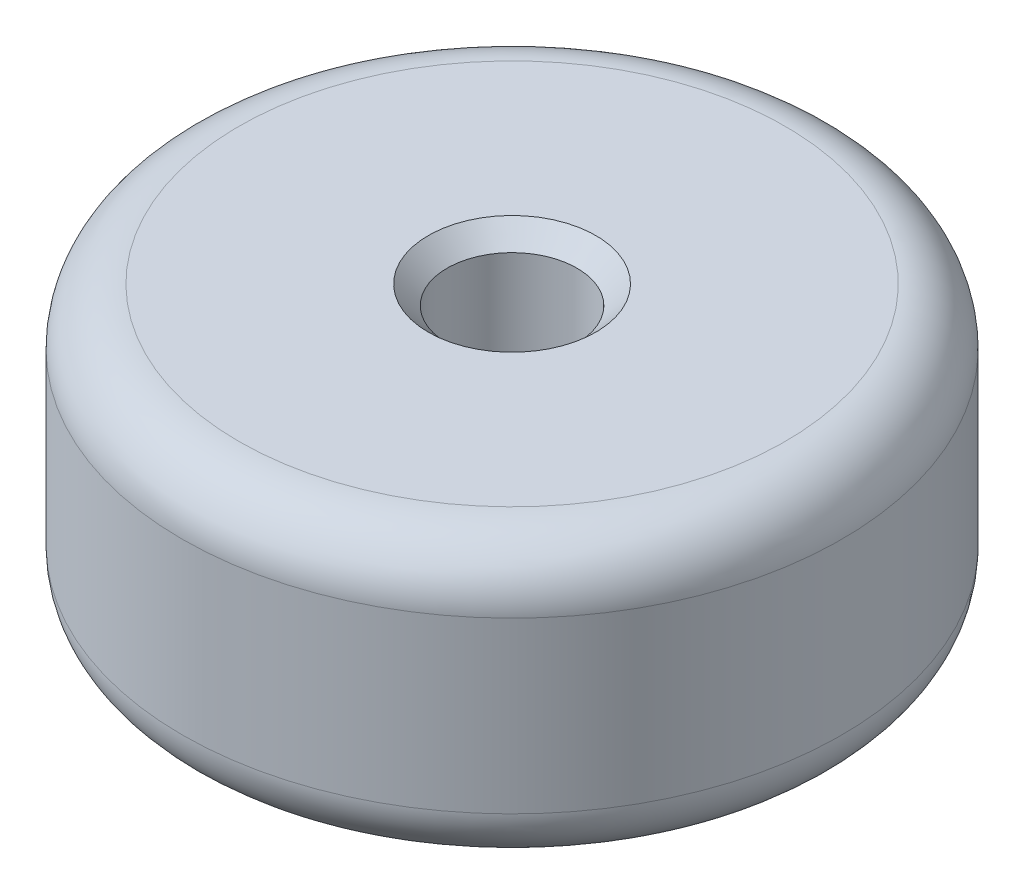
ISO-10303-21;
HEADER;
FILE_DESCRIPTION(('STEP AP214'),'2;1');
FILE_NAME('part.step','',(''),(''),'','','');
FILE_SCHEMA(('AUTOMOTIVE_DESIGN { 1 0 10303 214 1 1 1 1 }'));
ENDSEC;
DATA;
#1=APPLICATION_CONTEXT('core data for automotive mechanical design processes');
#2=APPLICATION_PROTOCOL_DEFINITION('international standard','automotive_design',2000,#1);
#3=PRODUCT_CONTEXT('',#1,'mechanical');
#4=PRODUCT('Part','Part','',(#3));
#5=PRODUCT_RELATED_PRODUCT_CATEGORY('part','',(#4));
#6=PRODUCT_DEFINITION_FORMATION('','',#4);
#7=PRODUCT_DEFINITION_CONTEXT('part definition',#1,'design');
#8=PRODUCT_DEFINITION('design','',#6,#7);
#9=PRODUCT_DEFINITION_SHAPE('','',#8);
#10=(LENGTH_UNIT() NAMED_UNIT(*) SI_UNIT(.MILLI.,.METRE.));
#11=(NAMED_UNIT(*) PLANE_ANGLE_UNIT() SI_UNIT($,.RADIAN.));
#12=(NAMED_UNIT(*) SI_UNIT($,.STERADIAN.) SOLID_ANGLE_UNIT());
#13=UNCERTAINTY_MEASURE_WITH_UNIT(LENGTH_MEASURE(1.E-05),#10,'distance_accuracy_value','');
#14=(GEOMETRIC_REPRESENTATION_CONTEXT(3) GLOBAL_UNCERTAINTY_ASSIGNED_CONTEXT((#13)) GLOBAL_UNIT_ASSIGNED_CONTEXT((#10,
#11,#12)) REPRESENTATION_CONTEXT('',''));
#15=CARTESIAN_POINT('',(0.,0.,0.));
#16=DIRECTION('',(0.,0.,1.));
#17=DIRECTION('',(1.,0.,0.));
#18=AXIS2_PLACEMENT_3D('',#15,#16,#17);
#19=CARTESIAN_POINT('',(0.,7.50000000000001,0.));
#20=DIRECTION('',(0.,-1.,0.));
#21=DIRECTION('',(0.,0.,-1.));
#22=AXIS2_PLACEMENT_3D('',#19,#20,#21);
#23=CYLINDRICAL_SURFACE('',#22,17.5);
#24=CARTESIAN_POINT('',(0.,-4.5,0.));
#25=DIRECTION('',(0.,1.,0.));
#26=DIRECTION('',(0.,0.,1.));
#27=AXIS2_PLACEMENT_3D('',#24,#25,#26);
#28=CIRCLE('',#27,17.5);
#29=CARTESIAN_POINT('',(0.,-4.5,17.5));
#30=VERTEX_POINT('',#29);
#31=EDGE_CURVE('E60',#30,#30,#28,.T.);
#32=ORIENTED_EDGE('',*,*,#31,.T.);
#33=EDGE_LOOP('',(#32));
#34=FACE_BOUND('',#33,.T.);
#35=CARTESIAN_POINT('',(0.,4.5,0.));
#36=DIRECTION('',(0.,1.,0.));
#37=DIRECTION('',(0.,0.,1.));
#38=AXIS2_PLACEMENT_3D('',#35,#36,#37);
#39=CIRCLE('',#38,17.5);
#40=CARTESIAN_POINT('',(0.,4.5,17.5));
#41=VERTEX_POINT('',#40);
#42=EDGE_CURVE('E63',#41,#41,#39,.F.);
#43=ORIENTED_EDGE('',*,*,#42,.T.);
#44=EDGE_LOOP('',(#43));
#45=FACE_BOUND('',#44,.T.);
#46=ADVANCED_FACE('F34',(#34,#45),#23,.T.);
#47=CARTESIAN_POINT('',(0.,7.50000000000001,0.));
#48=DIRECTION('',(0.,1.,0.));
#49=DIRECTION('',(0.,0.,1.));
#50=AXIS2_PLACEMENT_3D('',#47,#48,#49);
#51=PLANE('',#50);
#52=CARTESIAN_POINT('',(0.,7.50000000000001,0.));
#53=DIRECTION('',(0.,1.,0.));
#54=DIRECTION('',(0.,0.,1.));
#55=AXIS2_PLACEMENT_3D('',#52,#53,#54);
#56=CIRCLE('',#55,4.44800000000001);
#57=CARTESIAN_POINT('',(0.,7.50000000000001,4.44800000000001));
#58=VERTEX_POINT('',#57);
#59=EDGE_CURVE('E41',#58,#58,#56,.F.);
#60=ORIENTED_EDGE('',*,*,#59,.T.);
#61=EDGE_LOOP('',(#60));
#62=FACE_BOUND('',#61,.T.);
#63=CARTESIAN_POINT('',(0.,7.50000000000001,0.));
#64=DIRECTION('',(0.,1.,0.));
#65=DIRECTION('',(0.,0.,1.));
#66=AXIS2_PLACEMENT_3D('',#63,#64,#65);
#67=CIRCLE('',#66,14.5);
#68=CARTESIAN_POINT('',(0.,7.50000000000001,14.5));
#69=VERTEX_POINT('',#68);
#70=EDGE_CURVE('E54',#69,#69,#67,.T.);
#71=ORIENTED_EDGE('',*,*,#70,.T.);
#72=EDGE_LOOP('',(#71));
#73=FACE_BOUND('',#72,.T.);
#74=ADVANCED_FACE('F76',(#62,#73),#51,.T.);
#75=CARTESIAN_POINT('',(0.,-7.50000000000001,0.));
#76=DIRECTION('',(0.,1.,0.));
#77=DIRECTION('',(0.,0.,1.));
#78=AXIS2_PLACEMENT_3D('',#75,#76,#77);
#79=PLANE('',#78);
#80=CARTESIAN_POINT('',(0.,-7.50000000000001,0.));
#81=DIRECTION('',(0.,1.,0.));
#82=DIRECTION('',(0.,0.,1.));
#83=AXIS2_PLACEMENT_3D('',#80,#81,#82);
#84=CIRCLE('',#83,4.44800000000001);
#85=CARTESIAN_POINT('',(0.,-7.50000000000001,4.44800000000001));
#86=VERTEX_POINT('',#85);
#87=EDGE_CURVE('E10',#86,#86,#84,.T.);
#88=ORIENTED_EDGE('',*,*,#87,.T.);
#89=EDGE_LOOP('',(#88));
#90=FACE_BOUND('',#89,.T.);
#91=CARTESIAN_POINT('',(0.,-7.50000000000001,0.));
#92=DIRECTION('',(0.,1.,0.));
#93=DIRECTION('',(0.,0.,1.));
#94=AXIS2_PLACEMENT_3D('',#91,#92,#93);
#95=CIRCLE('',#94,14.5);
#96=CARTESIAN_POINT('',(0.,-7.50000000000001,14.5));
#97=VERTEX_POINT('',#96);
#98=EDGE_CURVE('E57',#97,#97,#95,.F.);
#99=ORIENTED_EDGE('',*,*,#98,.T.);
#100=EDGE_LOOP('',(#99));
#101=FACE_BOUND('',#100,.T.);
#102=ADVANCED_FACE('F78',(#90,#101),#79,.F.);
#103=CARTESIAN_POINT('',(0.,-4.5,0.));
#104=DIRECTION('',(0.,1.,0.));
#105=DIRECTION('',(0.,0.,1.));
#106=AXIS2_PLACEMENT_3D('',#103,#104,#105);
#107=TOROIDAL_SURFACE('',#106,14.5,3.);
#108=ORIENTED_EDGE('',*,*,#98,.F.);
#109=EDGE_LOOP('',(#108));
#110=FACE_BOUND('',#109,.T.);
#111=ORIENTED_EDGE('',*,*,#31,.F.);
#112=EDGE_LOOP('',(#111));
#113=FACE_BOUND('',#112,.T.);
#114=ADVANCED_FACE('F72',(#110,#113),#107,.T.);
#115=CARTESIAN_POINT('',(0.,4.5,0.));
#116=DIRECTION('',(0.,1.,0.));
#117=DIRECTION('',(0.,0.,1.));
#118=AXIS2_PLACEMENT_3D('',#115,#116,#117);
#119=TOROIDAL_SURFACE('',#118,14.5,3.);
#120=ORIENTED_EDGE('',*,*,#42,.F.);
#121=EDGE_LOOP('',(#120));
#122=FACE_BOUND('',#121,.T.);
#123=ORIENTED_EDGE('',*,*,#70,.F.);
#124=EDGE_LOOP('',(#123));
#125=FACE_BOUND('',#124,.T.);
#126=ADVANCED_FACE('F68',(#122,#125),#119,.T.);
#127=CARTESIAN_POINT('',(0.,-7.50000000000001,0.));
#128=DIRECTION('',(0.,1.,0.));
#129=DIRECTION('',(0.,0.,1.));
#130=AXIS2_PLACEMENT_3D('',#127,#128,#129);
#131=CYLINDRICAL_SURFACE('',#130,3.448);
#132=CARTESIAN_POINT('',(0.,6.49999999999999,0.));
#133=DIRECTION('',(0.,1.,0.));
#134=DIRECTION('',(0.,0.,1.));
#135=AXIS2_PLACEMENT_3D('',#132,#133,#134);
#136=CIRCLE('',#135,3.448);
#137=CARTESIAN_POINT('',(0.,6.49999999999999,3.448));
#138=VERTEX_POINT('',#137);
#139=EDGE_CURVE('E45',#138,#138,#136,.T.);
#140=ORIENTED_EDGE('',*,*,#139,.T.);
#141=EDGE_LOOP('',(#140));
#142=FACE_BOUND('',#141,.T.);
#143=CARTESIAN_POINT('',(0.,-6.49999999999998,0.));
#144=DIRECTION('',(0.,1.,0.));
#145=DIRECTION('',(0.,0.,1.));
#146=AXIS2_PLACEMENT_3D('',#143,#144,#145);
#147=CIRCLE('',#146,3.448);
#148=CARTESIAN_POINT('',(0.,-6.49999999999998,3.448));
#149=VERTEX_POINT('',#148);
#150=EDGE_CURVE('E49',#149,#149,#147,.F.);
#151=ORIENTED_EDGE('',*,*,#150,.T.);
#152=EDGE_LOOP('',(#151));
#153=FACE_BOUND('',#152,.T.);
#154=ADVANCED_FACE('F71',(#142,#153),#131,.F.);
#155=CARTESIAN_POINT('',(0.,6.49999999999999,0.));
#156=DIRECTION('',(0.,1.,0.));
#157=DIRECTION('',(0.,0.,1.));
#158=AXIS2_PLACEMENT_3D('',#155,#156,#157);
#159=CONICAL_SURFACE('',#158,3.448,0.785398163397449);
#160=ORIENTED_EDGE('',*,*,#59,.F.);
#161=EDGE_LOOP('',(#160));
#162=FACE_BOUND('',#161,.T.);
#163=ORIENTED_EDGE('',*,*,#139,.F.);
#164=EDGE_LOOP('',(#163));
#165=FACE_BOUND('',#164,.T.);
#166=ADVANCED_FACE('F91',(#162,#165),#159,.F.);
#167=CARTESIAN_POINT('',(0.,-7.50000000000001,0.));
#168=DIRECTION('',(0.,-1.,0.));
#169=DIRECTION('',(0.,0.,-1.));
#170=AXIS2_PLACEMENT_3D('',#167,#168,#169);
#171=CONICAL_SURFACE('',#170,4.44800000000001,0.785398163397444);
#172=ORIENTED_EDGE('',*,*,#150,.F.);
#173=EDGE_LOOP('',(#172));
#174=FACE_BOUND('',#173,.T.);
#175=ORIENTED_EDGE('',*,*,#87,.F.);
#176=EDGE_LOOP('',(#175));
#177=FACE_BOUND('',#176,.T.);
#178=ADVANCED_FACE('F36',(#174,#177),#171,.F.);
#179=CLOSED_SHELL('',(#46,#74,#102,#114,#126,#154,#166,#178));
#180=MANIFOLD_SOLID_BREP('B2',#179);
#181=ADVANCED_BREP_SHAPE_REPRESENTATION('',(#18,#180),#14);
#182=SHAPE_DEFINITION_REPRESENTATION(#9,#181);
ENDSEC;
END-ISO-10303-21;
